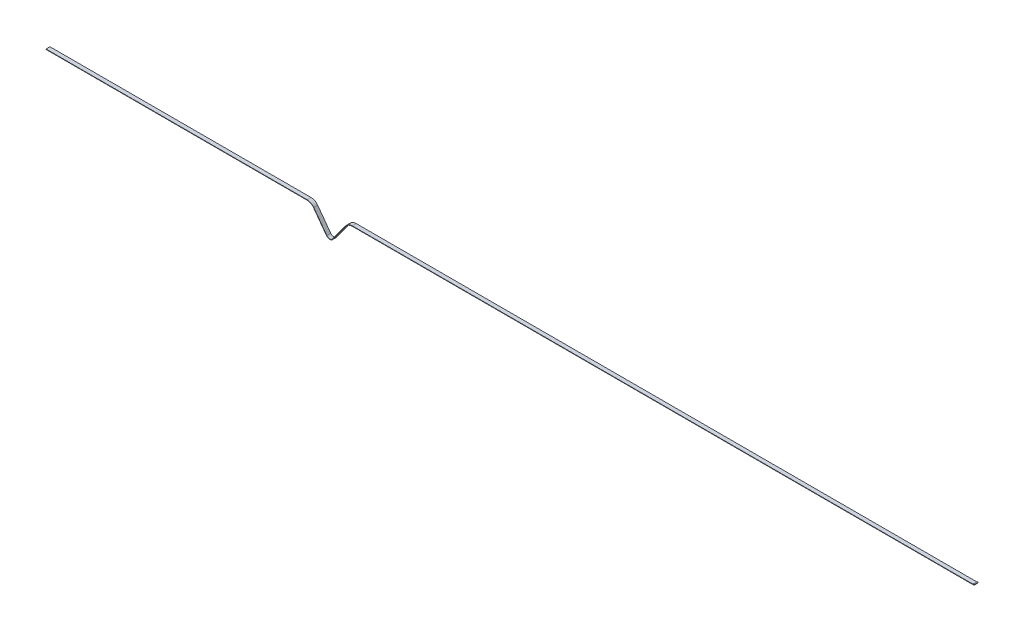
ISO-10303-21;
HEADER;
FILE_DESCRIPTION(('STEP AP214'),'2;1');
FILE_NAME('part.step','',(''),(''),'','','');
FILE_SCHEMA(('AUTOMOTIVE_DESIGN { 1 0 10303 214 1 1 1 1 }'));
ENDSEC;
DATA;
#1=APPLICATION_CONTEXT('core data for automotive mechanical design processes');
#2=APPLICATION_PROTOCOL_DEFINITION('international standard','automotive_design',2000,#1);
#3=PRODUCT_CONTEXT('',#1,'mechanical');
#4=PRODUCT('Part','Part','',(#3));
#5=PRODUCT_RELATED_PRODUCT_CATEGORY('part','',(#4));
#6=PRODUCT_DEFINITION_FORMATION('','',#4);
#7=PRODUCT_DEFINITION_CONTEXT('part definition',#1,'design');
#8=PRODUCT_DEFINITION('design','',#6,#7);
#9=PRODUCT_DEFINITION_SHAPE('','',#8);
#10=(LENGTH_UNIT() NAMED_UNIT(*) SI_UNIT(.MILLI.,.METRE.));
#11=(NAMED_UNIT(*) PLANE_ANGLE_UNIT() SI_UNIT($,.RADIAN.));
#12=(NAMED_UNIT(*) SI_UNIT($,.STERADIAN.) SOLID_ANGLE_UNIT());
#13=UNCERTAINTY_MEASURE_WITH_UNIT(LENGTH_MEASURE(1.E-05),#10,'distance_accuracy_value','');
#14=(GEOMETRIC_REPRESENTATION_CONTEXT(3) GLOBAL_UNCERTAINTY_ASSIGNED_CONTEXT((#13)) GLOBAL_UNIT_ASSIGNED_CONTEXT((#10,
#11,#12)) REPRESENTATION_CONTEXT('',''));
#15=CARTESIAN_POINT('',(0.,0.,0.));
#16=DIRECTION('',(0.,0.,1.));
#17=DIRECTION('',(1.,0.,0.));
#18=AXIS2_PLACEMENT_3D('',#15,#16,#17);
#19=CARTESIAN_POINT('',(0.,0.,0.));
#20=DIRECTION('',(-1.,0.,0.));
#21=DIRECTION('',(0.,0.,1.));
#22=AXIS2_PLACEMENT_3D('',#19,#20,#21);
#23=PLANE('',#22);
#24=DIRECTION('',(0.,-1.,0.));
#25=VECTOR('',#24,1.);
#26=CARTESIAN_POINT('',(0.,0.,0.));
#27=LINE('',#26,#25);
#28=CARTESIAN_POINT('',(0.,0.63,0.));
#29=VERTEX_POINT('',#28);
#30=CARTESIAN_POINT('',(0.,0.,0.));
#31=VERTEX_POINT('',#30);
#32=EDGE_CURVE('E247',#29,#31,#27,.T.);
#33=ORIENTED_EDGE('',*,*,#32,.T.);
#34=DIRECTION('',(0.,0.,-1.));
#35=VECTOR('',#34,1.);
#36=CARTESIAN_POINT('',(0.,0.,0.));
#37=LINE('',#36,#35);
#38=CARTESIAN_POINT('',(0.,0.,-6.));
#39=VERTEX_POINT('',#38);
#40=EDGE_CURVE('E181',#31,#39,#37,.T.);
#41=ORIENTED_EDGE('',*,*,#40,.T.);
#42=DIRECTION('',(0.,1.,0.));
#43=VECTOR('',#42,1.);
#44=CARTESIAN_POINT('',(0.,0.,-6.));
#45=LINE('',#44,#43);
#46=CARTESIAN_POINT('',(0.,0.63,-6.));
#47=VERTEX_POINT('',#46);
#48=EDGE_CURVE('E167',#39,#47,#45,.T.);
#49=ORIENTED_EDGE('',*,*,#48,.T.);
#50=DIRECTION('',(0.,0.,1.));
#51=VECTOR('',#50,1.);
#52=CARTESIAN_POINT('',(0.,0.63,0.));
#53=LINE('',#52,#51);
#54=EDGE_CURVE('E156',#47,#29,#53,.T.);
#55=ORIENTED_EDGE('',*,*,#54,.T.);
#56=EDGE_LOOP('',(#33,#41,#49,#55));
#57=FACE_BOUND('',#56,.T.);
#58=ADVANCED_FACE('F33',(#57),#23,.F.);
#59=CARTESIAN_POINT('',(-1422.4,0.,0.));
#60=DIRECTION('',(-1.,0.,0.));
#61=DIRECTION('',(0.,0.,1.));
#62=AXIS2_PLACEMENT_3D('',#59,#60,#61);
#63=PLANE('',#62);
#64=DIRECTION('',(0.,-1.,0.));
#65=VECTOR('',#64,1.);
#66=CARTESIAN_POINT('',(-1422.4,0.,0.));
#67=LINE('',#66,#65);
#68=CARTESIAN_POINT('',(-1422.4,0.629999999999918,0.));
#69=VERTEX_POINT('',#68);
#70=CARTESIAN_POINT('',(-1422.4,0.,0.));
#71=VERTEX_POINT('',#70);
#72=EDGE_CURVE('E55',#69,#71,#67,.T.);
#73=ORIENTED_EDGE('',*,*,#72,.F.);
#74=DIRECTION('',(0.,0.,1.));
#75=VECTOR('',#74,1.);
#76=CARTESIAN_POINT('',(-1422.4,0.629999999999918,0.));
#77=LINE('',#76,#75);
#78=CARTESIAN_POINT('',(-1422.4,0.629999999999918,-6.));
#79=VERTEX_POINT('',#78);
#80=EDGE_CURVE('E243',#79,#69,#77,.T.);
#81=ORIENTED_EDGE('',*,*,#80,.F.);
#82=DIRECTION('',(0.,1.,0.));
#83=VECTOR('',#82,1.);
#84=CARTESIAN_POINT('',(-1422.4,0.,-6.));
#85=LINE('',#84,#83);
#86=CARTESIAN_POINT('',(-1422.4,0.,-6.));
#87=VERTEX_POINT('',#86);
#88=EDGE_CURVE('E237',#87,#79,#85,.T.);
#89=ORIENTED_EDGE('',*,*,#88,.F.);
#90=DIRECTION('',(0.,0.,-1.));
#91=VECTOR('',#90,1.);
#92=CARTESIAN_POINT('',(-1422.4,0.,0.));
#93=LINE('',#92,#91);
#94=EDGE_CURVE('E11',#71,#87,#93,.T.);
#95=ORIENTED_EDGE('',*,*,#94,.F.);
#96=EDGE_LOOP('',(#73,#81,#89,#95));
#97=FACE_BOUND('',#96,.T.);
#98=ADVANCED_FACE('F367',(#97),#63,.T.);
#99=CARTESIAN_POINT('',(0.,0.,-6.));
#100=DIRECTION('',(0.,0.,1.));
#101=DIRECTION('',(1.,0.,0.));
#102=AXIS2_PLACEMENT_3D('',#99,#100,#101);
#103=PLANE('',#102);
#104=DIRECTION('',(-1.,0.,0.));
#105=VECTOR('',#104,1.);
#106=CARTESIAN_POINT('',(0.,0.63,-6.));
#107=LINE('',#106,#105);
#108=CARTESIAN_POINT('',(-1.5,0.63,-6.));
#109=VERTEX_POINT('',#108);
#110=CARTESIAN_POINT('',(-953.012225303262,0.629999999999884,-6.));
#111=VERTEX_POINT('',#110);
#112=EDGE_CURVE('E164',#109,#111,#107,.T.);
#113=ORIENTED_EDGE('',*,*,#112,.F.);
#114=CARTESIAN_POINT('',(-0.75,0.63,-6.));
#115=DIRECTION('',(0.,0.,1.));
#116=DIRECTION('',(1.,0.,0.));
#117=AXIS2_PLACEMENT_3D('',#114,#115,#116);
#118=CIRCLE('',#117,0.75);
#119=EDGE_CURVE('E150',#47,#109,#118,.T.);
#120=ORIENTED_EDGE('',*,*,#119,.F.);
#121=ORIENTED_EDGE('',*,*,#48,.F.);
#122=DIRECTION('',(-1.,0.,0.));
#123=VECTOR('',#122,1.);
#124=CARTESIAN_POINT('',(0.,0.,-6.));
#125=LINE('',#124,#123);
#126=CARTESIAN_POINT('',(-953.012225303262,-1.16226472890446E-13,-6.));
#127=VERTEX_POINT('',#126);
#128=EDGE_CURVE('E176',#39,#127,#125,.T.);
#129=ORIENTED_EDGE('',*,*,#128,.T.);
#130=DIRECTION('',(0.,1.,0.));
#131=VECTOR('',#130,1.);
#132=CARTESIAN_POINT('',(-953.012225303262,-1.16226472890446E-13,-6.));
#133=LINE('',#132,#131);
#134=EDGE_CURVE('E172',#127,#111,#133,.T.);
#135=ORIENTED_EDGE('',*,*,#134,.T.);
#136=EDGE_LOOP('',(#113,#120,#121,#129,#135));
#137=FACE_BOUND('',#136,.T.);
#138=ADVANCED_FACE('F170',(#137),#103,.F.);
#139=CARTESIAN_POINT('',(0.,0.63,0.));
#140=DIRECTION('',(0.,-1.,0.));
#141=DIRECTION('',(1.,0.,0.));
#142=AXIS2_PLACEMENT_3D('',#139,#140,#141);
#143=PLANE('',#142);
#144=DIRECTION('',(-1.,0.,0.));
#145=VECTOR('',#144,1.);
#146=CARTESIAN_POINT('',(0.,0.63,0.));
#147=LINE('',#146,#145);
#148=CARTESIAN_POINT('',(-1.5,0.63,0.));
#149=VERTEX_POINT('',#148);
#150=CARTESIAN_POINT('',(-953.012225303262,0.629999999999884,0.));
#151=VERTEX_POINT('',#150);
#152=EDGE_CURVE('E166',#149,#151,#147,.T.);
#153=ORIENTED_EDGE('',*,*,#152,.F.);
#154=DIRECTION('',(0.,0.,1.));
#155=VECTOR('',#154,1.);
#156=CARTESIAN_POINT('',(-1.5,0.63,-6.));
#157=LINE('',#156,#155);
#158=EDGE_CURVE('E153',#109,#149,#157,.T.);
#159=ORIENTED_EDGE('',*,*,#158,.F.);
#160=ORIENTED_EDGE('',*,*,#112,.T.);
#161=DIRECTION('',(0.,0.,1.));
#162=VECTOR('',#161,1.);
#163=CARTESIAN_POINT('',(-953.012225303262,0.629999999999884,0.));
#164=LINE('',#163,#162);
#165=EDGE_CURVE('E173',#111,#151,#164,.T.);
#166=ORIENTED_EDGE('',*,*,#165,.T.);
#167=EDGE_LOOP('',(#153,#159,#160,#166));
#168=FACE_BOUND('',#167,.T.);
#169=ADVANCED_FACE('F162',(#168),#143,.F.);
#170=CARTESIAN_POINT('',(0.,0.,0.));
#171=DIRECTION('',(0.,0.,-1.));
#172=DIRECTION('',(-1.,0.,0.));
#173=AXIS2_PLACEMENT_3D('',#170,#171,#172);
#174=PLANE('',#173);
#175=DIRECTION('',(0.,-1.,0.));
#176=VECTOR('',#175,1.);
#177=CARTESIAN_POINT('',(-953.012225303262,-1.16226472890446E-13,0.));
#178=LINE('',#177,#176);
#179=CARTESIAN_POINT('',(-953.012225303262,-1.16226472890446E-13,0.));
#180=VERTEX_POINT('',#179);
#181=EDGE_CURVE('E250',#151,#180,#178,.T.);
#182=ORIENTED_EDGE('',*,*,#181,.T.);
#183=DIRECTION('',(-1.,0.,0.));
#184=VECTOR('',#183,1.);
#185=CARTESIAN_POINT('',(0.,0.,0.));
#186=LINE('',#185,#184);
#187=EDGE_CURVE('E288',#31,#180,#186,.T.);
#188=ORIENTED_EDGE('',*,*,#187,.F.);
#189=ORIENTED_EDGE('',*,*,#32,.F.);
#190=CARTESIAN_POINT('',(-0.75,0.63,0.));
#191=DIRECTION('',(0.,0.,1.));
#192=DIRECTION('',(1.,0.,0.));
#193=AXIS2_PLACEMENT_3D('',#190,#191,#192);
#194=CIRCLE('',#193,0.75);
#195=EDGE_CURVE('E47',#29,#149,#194,.T.);
#196=ORIENTED_EDGE('',*,*,#195,.T.);
#197=ORIENTED_EDGE('',*,*,#152,.T.);
#198=EDGE_LOOP('',(#182,#188,#189,#196,#197));
#199=FACE_BOUND('',#198,.T.);
#200=ADVANCED_FACE('F415',(#199),#174,.F.);
#201=CARTESIAN_POINT('',(0.,0.,0.));
#202=DIRECTION('',(0.,1.,0.));
#203=DIRECTION('',(-1.,0.,0.));
#204=AXIS2_PLACEMENT_3D('',#201,#202,#203);
#205=PLANE('',#204);
#206=DIRECTION('',(0.,0.,-1.));
#207=VECTOR('',#206,1.);
#208=CARTESIAN_POINT('',(-953.012225303262,-1.16226472890446E-13,0.));
#209=LINE('',#208,#207);
#210=EDGE_CURVE('E192',#180,#127,#209,.T.);
#211=ORIENTED_EDGE('',*,*,#210,.T.);
#212=ORIENTED_EDGE('',*,*,#128,.F.);
#213=ORIENTED_EDGE('',*,*,#40,.F.);
#214=ORIENTED_EDGE('',*,*,#187,.T.);
#215=EDGE_LOOP('',(#211,#212,#213,#214));
#216=FACE_BOUND('',#215,.T.);
#217=ADVANCED_FACE('F408',(#216),#205,.F.);
#218=CARTESIAN_POINT('',(-953.012225303262,-1.05818132034585E-13,-6.));
#219=DIRECTION('',(0.,0.,1.));
#220=DIRECTION('',(1.,0.,0.));
#221=AXIS2_PLACEMENT_3D('',#218,#219,#220);
#222=PLANE('',#221);
#223=CARTESIAN_POINT('',(-953.012225303262,-11.949999999988,-6.));
#224=DIRECTION('',(0.,0.,1.));
#225=DIRECTION('',(0.,1.,0.));
#226=AXIS2_PLACEMENT_3D('',#223,#224,#225);
#227=CIRCLE('',#226,12.5799999999879);
#228=CARTESIAN_POINT('',(-963.152722602893,-4.50508801153134,-6.));
#229=VERTEX_POINT('',#228);
#230=EDGE_CURVE('E185',#111,#229,#227,.T.);
#231=ORIENTED_EDGE('',*,*,#230,.F.);
#232=ORIENTED_EDGE('',*,*,#134,.F.);
#233=CARTESIAN_POINT('',(-953.012225303262,-11.949999999988,-6.));
#234=DIRECTION('',(0.,0.,1.));
#235=DIRECTION('',(0.,1.,0.));
#236=AXIS2_PLACEMENT_3D('',#233,#234,#235);
#237=CIRCLE('',#236,11.9499999999879);
#238=CARTESIAN_POINT('',(-962.644891657044,-4.877925416359,-6.));
#239=VERTEX_POINT('',#238);
#240=EDGE_CURVE('E186',#127,#239,#237,.T.);
#241=ORIENTED_EDGE('',*,*,#240,.T.);
#242=DIRECTION('',(-0.806080866426157,0.591805404488381,0.));
#243=VECTOR('',#242,1.);
#244=CARTESIAN_POINT('',(-962.644891657044,-4.877925416359,-6.));
#245=LINE('',#244,#243);
#246=EDGE_CURVE('E182',#239,#229,#245,.T.);
#247=ORIENTED_EDGE('',*,*,#246,.T.);
#248=EDGE_LOOP('',(#231,#232,#241,#247));
#249=FACE_BOUND('',#248,.T.);
#250=ADVANCED_FACE('F406',(#249),#222,.F.);
#251=CARTESIAN_POINT('',(-953.012225303262,-11.949999999988,0.));
#252=DIRECTION('',(0.,0.,1.));
#253=DIRECTION('',(1.,0.,0.));
#254=AXIS2_PLACEMENT_3D('',#251,#252,#253);
#255=CYLINDRICAL_SURFACE('',#254,12.5799999999879);
#256=CARTESIAN_POINT('',(-953.012225303262,-11.949999999988,0.));
#257=DIRECTION('',(0.,0.,1.));
#258=DIRECTION('',(0.,1.,0.));
#259=AXIS2_PLACEMENT_3D('',#256,#257,#258);
#260=CIRCLE('',#259,12.5799999999879);
#261=CARTESIAN_POINT('',(-963.152722602893,-4.50508801153134,0.));
#262=VERTEX_POINT('',#261);
#263=EDGE_CURVE('E253',#151,#262,#260,.T.);
#264=ORIENTED_EDGE('',*,*,#263,.F.);
#265=ORIENTED_EDGE('',*,*,#165,.F.);
#266=ORIENTED_EDGE('',*,*,#230,.T.);
#267=DIRECTION('',(0.,0.,1.));
#268=VECTOR('',#267,1.);
#269=CARTESIAN_POINT('',(-963.152722602893,-4.50508801153132,0.));
#270=LINE('',#269,#268);
#271=EDGE_CURVE('E189',#229,#262,#270,.T.);
#272=ORIENTED_EDGE('',*,*,#271,.T.);
#273=EDGE_LOOP('',(#264,#265,#266,#272));
#274=FACE_BOUND('',#273,.T.);
#275=ADVANCED_FACE('F404',(#274),#255,.T.);
#276=CARTESIAN_POINT('',(-953.012225303262,-1.05818132034585E-13,0.));
#277=DIRECTION('',(0.,0.,-1.));
#278=DIRECTION('',(-1.,0.,0.));
#279=AXIS2_PLACEMENT_3D('',#276,#277,#278);
#280=PLANE('',#279);
#281=CARTESIAN_POINT('',(-953.012225303262,-11.949999999988,0.));
#282=DIRECTION('',(0.,0.,1.));
#283=DIRECTION('',(0.,1.,0.));
#284=AXIS2_PLACEMENT_3D('',#281,#282,#283);
#285=CIRCLE('',#284,11.9499999999879);
#286=CARTESIAN_POINT('',(-962.644891657044,-4.877925416359,0.));
#287=VERTEX_POINT('',#286);
#288=EDGE_CURVE('E292',#180,#287,#285,.T.);
#289=ORIENTED_EDGE('',*,*,#288,.F.);
#290=ORIENTED_EDGE('',*,*,#181,.F.);
#291=ORIENTED_EDGE('',*,*,#263,.T.);
#292=DIRECTION('',(0.806080866426157,-0.591805404488381,0.));
#293=VECTOR('',#292,1.);
#294=CARTESIAN_POINT('',(-962.644891657044,-4.877925416359,0.));
#295=LINE('',#294,#293);
#296=EDGE_CURVE('E256',#262,#287,#295,.T.);
#297=ORIENTED_EDGE('',*,*,#296,.T.);
#298=EDGE_LOOP('',(#289,#290,#291,#297));
#299=FACE_BOUND('',#298,.T.);
#300=ADVANCED_FACE('F395',(#299),#280,.F.);
#301=CARTESIAN_POINT('',(-953.012225303262,-11.949999999988,0.));
#302=DIRECTION('',(0.,0.,1.));
#303=DIRECTION('',(1.,0.,0.));
#304=AXIS2_PLACEMENT_3D('',#301,#302,#303);
#305=CYLINDRICAL_SURFACE('',#304,11.9499999999879);
#306=DIRECTION('',(0.,0.,-1.));
#307=VECTOR('',#306,1.);
#308=CARTESIAN_POINT('',(-962.644891657044,-4.877925416359,0.));
#309=LINE('',#308,#307);
#310=EDGE_CURVE('E203',#287,#239,#309,.T.);
#311=ORIENTED_EDGE('',*,*,#310,.T.);
#312=ORIENTED_EDGE('',*,*,#240,.F.);
#313=ORIENTED_EDGE('',*,*,#210,.F.);
#314=ORIENTED_EDGE('',*,*,#288,.T.);
#315=EDGE_LOOP('',(#311,#312,#313,#314));
#316=FACE_BOUND('',#315,.T.);
#317=ADVANCED_FACE('F389',(#316),#305,.F.);
#318=CARTESIAN_POINT('',(-962.644891657044,-4.87792541635899,-6.));
#319=DIRECTION('',(0.,0.,1.));
#320=DIRECTION('',(1.,0.,0.));
#321=AXIS2_PLACEMENT_3D('',#318,#319,#320);
#322=PLANE('',#321);
#323=DIRECTION('',(-0.591805404488379,-0.806080866426159,0.));
#324=VECTOR('',#323,1.);
#325=CARTESIAN_POINT('',(-963.152722602893,-4.50508801153131,-6.));
#326=LINE('',#325,#324);
#327=CARTESIAN_POINT('',(-983.164902155259,-31.7630936165882,-6.));
#328=VERTEX_POINT('',#327);
#329=EDGE_CURVE('E196',#229,#328,#326,.T.);
#330=ORIENTED_EDGE('',*,*,#329,.F.);
#331=ORIENTED_EDGE('',*,*,#246,.F.);
#332=DIRECTION('',(-0.591805404488379,-0.806080866426159,0.));
#333=VECTOR('',#332,1.);
#334=CARTESIAN_POINT('',(-962.644891657044,-4.87792541635899,-6.));
#335=LINE('',#334,#333);
#336=CARTESIAN_POINT('',(-982.657071209411,-32.1359310214159,-6.));
#337=VERTEX_POINT('',#336);
#338=EDGE_CURVE('E197',#239,#337,#335,.T.);
#339=ORIENTED_EDGE('',*,*,#338,.T.);
#340=DIRECTION('',(-0.806080866426158,0.591805404488379,0.));
#341=VECTOR('',#340,1.);
#342=CARTESIAN_POINT('',(-982.657071209411,-32.1359310214159,-6.));
#343=LINE('',#342,#341);
#344=EDGE_CURVE('E193',#337,#328,#343,.T.);
#345=ORIENTED_EDGE('',*,*,#344,.T.);
#346=EDGE_LOOP('',(#330,#331,#339,#345));
#347=FACE_BOUND('',#346,.T.);
#348=ADVANCED_FACE('F383',(#347),#322,.F.);
#349=CARTESIAN_POINT('',(-963.152722602893,-4.50508801153131,0.));
#350=DIRECTION('',(0.806080866426159,-0.591805404488379,0.));
#351=DIRECTION('',(0.591805404488379,0.806080866426159,0.));
#352=AXIS2_PLACEMENT_3D('',#349,#350,#351);
#353=PLANE('',#352);
#354=DIRECTION('',(-0.591805404488379,-0.806080866426159,0.));
#355=VECTOR('',#354,1.);
#356=CARTESIAN_POINT('',(-963.152722602893,-4.50508801153131,0.));
#357=LINE('',#356,#355);
#358=CARTESIAN_POINT('',(-983.164902155259,-31.7630936165882,0.));
#359=VERTEX_POINT('',#358);
#360=EDGE_CURVE('E259',#262,#359,#357,.T.);
#361=ORIENTED_EDGE('',*,*,#360,.F.);
#362=ORIENTED_EDGE('',*,*,#271,.F.);
#363=ORIENTED_EDGE('',*,*,#329,.T.);
#364=DIRECTION('',(0.,0.,1.));
#365=VECTOR('',#364,1.);
#366=CARTESIAN_POINT('',(-983.164902155259,-31.7630936165882,0.));
#367=LINE('',#366,#365);
#368=EDGE_CURVE('E200',#328,#359,#367,.T.);
#369=ORIENTED_EDGE('',*,*,#368,.T.);
#370=EDGE_LOOP('',(#361,#362,#363,#369));
#371=FACE_BOUND('',#370,.T.);
#372=ADVANCED_FACE('F401',(#371),#353,.F.);
#373=CARTESIAN_POINT('',(-962.644891657044,-4.87792541635899,0.));
#374=DIRECTION('',(0.,0.,-1.));
#375=DIRECTION('',(-1.,0.,0.));
#376=AXIS2_PLACEMENT_3D('',#373,#374,#375);
#377=PLANE('',#376);
#378=DIRECTION('',(-0.591805404488379,-0.806080866426159,0.));
#379=VECTOR('',#378,1.);
#380=CARTESIAN_POINT('',(-962.644891657044,-4.87792541635899,0.));
#381=LINE('',#380,#379);
#382=CARTESIAN_POINT('',(-982.657071209411,-32.1359310214159,0.));
#383=VERTEX_POINT('',#382);
#384=EDGE_CURVE('E297',#287,#383,#381,.T.);
#385=ORIENTED_EDGE('',*,*,#384,.F.);
#386=ORIENTED_EDGE('',*,*,#296,.F.);
#387=ORIENTED_EDGE('',*,*,#360,.T.);
#388=DIRECTION('',(0.806080866426158,-0.591805404488379,0.));
#389=VECTOR('',#388,1.);
#390=CARTESIAN_POINT('',(-982.657071209411,-32.1359310214159,0.));
#391=LINE('',#390,#389);
#392=EDGE_CURVE('E262',#359,#383,#391,.T.);
#393=ORIENTED_EDGE('',*,*,#392,.T.);
#394=EDGE_LOOP('',(#385,#386,#387,#393));
#395=FACE_BOUND('',#394,.T.);
#396=ADVANCED_FACE('F398',(#395),#377,.F.);
#397=CARTESIAN_POINT('',(-962.644891657044,-4.87792541635899,0.));
#398=DIRECTION('',(-0.806080866426159,0.591805404488379,0.));
#399=DIRECTION('',(-0.591805404488379,-0.806080866426159,0.));
#400=AXIS2_PLACEMENT_3D('',#397,#398,#399);
#401=PLANE('',#400);
#402=DIRECTION('',(0.,0.,-1.));
#403=VECTOR('',#402,1.);
#404=CARTESIAN_POINT('',(-982.657071209411,-32.1359310214159,0.));
#405=LINE('',#404,#403);
#406=EDGE_CURVE('E214',#383,#337,#405,.T.);
#407=ORIENTED_EDGE('',*,*,#406,.T.);
#408=ORIENTED_EDGE('',*,*,#338,.F.);
#409=ORIENTED_EDGE('',*,*,#310,.F.);
#410=ORIENTED_EDGE('',*,*,#384,.T.);
#411=EDGE_LOOP('',(#407,#408,#409,#410));
#412=FACE_BOUND('',#411,.T.);
#413=ADVANCED_FACE('F386',(#412),#401,.F.);
#414=CARTESIAN_POINT('',(-982.657071209411,-32.1359310214159,-6.));
#415=DIRECTION('',(0.,0.,1.));
#416=DIRECTION('',(1.,0.,0.));
#417=AXIS2_PLACEMENT_3D('',#414,#415,#416);
#418=PLANE('',#417);
#419=CARTESIAN_POINT('',(-987.582225303274,-28.5199999999919,-6.));
#420=DIRECTION('',(0.,0.,-1.));
#421=DIRECTION('',(0.806080866426158,-0.59180540448838,0.));
#422=AXIS2_PLACEMENT_3D('',#419,#420,#421);
#423=CIRCLE('',#422,5.48000000000001);
#424=CARTESIAN_POINT('',(-991.99954845129,-31.7630936165873,-6.));
#425=VERTEX_POINT('',#424);
#426=EDGE_CURVE('E207',#328,#425,#423,.T.);
#427=ORIENTED_EDGE('',*,*,#426,.F.);
#428=ORIENTED_EDGE('',*,*,#344,.F.);
#429=CARTESIAN_POINT('',(-987.582225303274,-28.5199999999919,-6.));
#430=DIRECTION('',(0.,0.,-1.));
#431=DIRECTION('',(0.806080866426159,-0.591805404488378,0.));
#432=AXIS2_PLACEMENT_3D('',#429,#430,#431);
#433=CIRCLE('',#432,6.11000000000002);
#434=CARTESIAN_POINT('',(-992.507379397139,-32.1359310214148,-6.));
#435=VERTEX_POINT('',#434);
#436=EDGE_CURVE('E208',#337,#435,#433,.T.);
#437=ORIENTED_EDGE('',*,*,#436,.T.);
#438=DIRECTION('',(0.806080866426291,0.591805404488199,0.));
#439=VECTOR('',#438,1.);
#440=CARTESIAN_POINT('',(-992.507379397139,-32.1359310214148,-6.));
#441=LINE('',#440,#439);
#442=EDGE_CURVE('E204',#435,#425,#441,.T.);
#443=ORIENTED_EDGE('',*,*,#442,.T.);
#444=EDGE_LOOP('',(#427,#428,#437,#443));
#445=FACE_BOUND('',#444,.T.);
#446=ADVANCED_FACE('F380',(#445),#418,.F.);
#447=CARTESIAN_POINT('',(-987.582225303274,-28.5199999999919,0.));
#448=DIRECTION('',(0.,0.,-1.));
#449=DIRECTION('',(-1.,0.,0.));
#450=AXIS2_PLACEMENT_3D('',#447,#448,#449);
#451=CYLINDRICAL_SURFACE('',#450,5.48000000000001);
#452=CARTESIAN_POINT('',(-987.582225303274,-28.5199999999919,0.));
#453=DIRECTION('',(0.,0.,-1.));
#454=DIRECTION('',(0.806080866426158,-0.59180540448838,0.));
#455=AXIS2_PLACEMENT_3D('',#452,#453,#454);
#456=CIRCLE('',#455,5.48000000000001);
#457=CARTESIAN_POINT('',(-991.99954845129,-31.7630936165873,0.));
#458=VERTEX_POINT('',#457);
#459=EDGE_CURVE('E265',#359,#458,#456,.T.);
#460=ORIENTED_EDGE('',*,*,#459,.F.);
#461=ORIENTED_EDGE('',*,*,#368,.F.);
#462=ORIENTED_EDGE('',*,*,#426,.T.);
#463=DIRECTION('',(0.,0.,1.));
#464=VECTOR('',#463,1.);
#465=CARTESIAN_POINT('',(-991.99954845129,-31.7630936165872,0.));
#466=LINE('',#465,#464);
#467=EDGE_CURVE('E211',#425,#458,#466,.T.);
#468=ORIENTED_EDGE('',*,*,#467,.T.);
#469=EDGE_LOOP('',(#460,#461,#462,#468));
#470=FACE_BOUND('',#469,.T.);
#471=ADVANCED_FACE('F377',(#470),#451,.F.);
#472=CARTESIAN_POINT('',(-982.657071209411,-32.1359310214159,0.));
#473=DIRECTION('',(0.,0.,-1.));
#474=DIRECTION('',(-1.,0.,0.));
#475=AXIS2_PLACEMENT_3D('',#472,#473,#474);
#476=PLANE('',#475);
#477=CARTESIAN_POINT('',(-987.582225303274,-28.5199999999919,0.));
#478=DIRECTION('',(0.,0.,-1.));
#479=DIRECTION('',(0.806080866426159,-0.591805404488378,0.));
#480=AXIS2_PLACEMENT_3D('',#477,#478,#479);
#481=CIRCLE('',#480,6.11000000000002);
#482=CARTESIAN_POINT('',(-992.507379397139,-32.1359310214148,0.));
#483=VERTEX_POINT('',#482);
#484=EDGE_CURVE('E302',#383,#483,#481,.T.);
#485=ORIENTED_EDGE('',*,*,#484,.F.);
#486=ORIENTED_EDGE('',*,*,#392,.F.);
#487=ORIENTED_EDGE('',*,*,#459,.T.);
#488=DIRECTION('',(-0.806080866426291,-0.591805404488199,0.));
#489=VECTOR('',#488,1.);
#490=CARTESIAN_POINT('',(-992.507379397139,-32.1359310214148,0.));
#491=LINE('',#490,#489);
#492=EDGE_CURVE('E268',#458,#483,#491,.T.);
#493=ORIENTED_EDGE('',*,*,#492,.T.);
#494=EDGE_LOOP('',(#485,#486,#487,#493));
#495=FACE_BOUND('',#494,.T.);
#496=ADVANCED_FACE('F355',(#495),#476,.F.);
#497=CARTESIAN_POINT('',(-987.582225303274,-28.5199999999919,0.));
#498=DIRECTION('',(0.,0.,-1.));
#499=DIRECTION('',(-1.,0.,0.));
#500=AXIS2_PLACEMENT_3D('',#497,#498,#499);
#501=CYLINDRICAL_SURFACE('',#500,6.11000000000002);
#502=DIRECTION('',(0.,0.,-1.));
#503=VECTOR('',#502,1.);
#504=CARTESIAN_POINT('',(-992.507379397139,-32.1359310214148,0.));
#505=LINE('',#504,#503);
#506=EDGE_CURVE('E225',#483,#435,#505,.T.);
#507=ORIENTED_EDGE('',*,*,#506,.T.);
#508=ORIENTED_EDGE('',*,*,#436,.F.);
#509=ORIENTED_EDGE('',*,*,#406,.F.);
#510=ORIENTED_EDGE('',*,*,#484,.T.);
#511=EDGE_LOOP('',(#507,#508,#509,#510));
#512=FACE_BOUND('',#511,.T.);
#513=ADVANCED_FACE('F350',(#512),#501,.T.);
#514=CARTESIAN_POINT('',(-992.507379397139,-32.1359310214147,-6.));
#515=DIRECTION('',(0.,0.,1.));
#516=DIRECTION('',(1.,0.,0.));
#517=AXIS2_PLACEMENT_3D('',#514,#515,#516);
#518=PLANE('',#517);
#519=DIRECTION('',(-0.591805404488197,0.806080866426292,0.));
#520=VECTOR('',#519,1.);
#521=CARTESIAN_POINT('',(-991.99954845129,-31.7630936165872,-6.));
#522=LINE('',#521,#520);
#523=CARTESIAN_POINT('',(-1012.01172800365,-4.50508801153305,-6.));
#524=VERTEX_POINT('',#523);
#525=EDGE_CURVE('E218',#425,#524,#522,.T.);
#526=ORIENTED_EDGE('',*,*,#525,.F.);
#527=ORIENTED_EDGE('',*,*,#442,.F.);
#528=DIRECTION('',(-0.591805404488197,0.806080866426292,0.));
#529=VECTOR('',#528,1.);
#530=CARTESIAN_POINT('',(-992.507379397139,-32.1359310214147,-6.));
#531=LINE('',#530,#529);
#532=CARTESIAN_POINT('',(-1012.51955894949,-4.87792541636061,-6.));
#533=VERTEX_POINT('',#532);
#534=EDGE_CURVE('E219',#435,#533,#531,.T.);
#535=ORIENTED_EDGE('',*,*,#534,.T.);
#536=DIRECTION('',(0.806080866426292,0.591805404488197,0.));
#537=VECTOR('',#536,1.);
#538=CARTESIAN_POINT('',(-1012.51955894949,-4.87792541636061,-6.));
#539=LINE('',#538,#537);
#540=EDGE_CURVE('E215',#533,#524,#539,.T.);
#541=ORIENTED_EDGE('',*,*,#540,.T.);
#542=EDGE_LOOP('',(#526,#527,#535,#541));
#543=FACE_BOUND('',#542,.T.);
#544=ADVANCED_FACE('F345',(#543),#518,.F.);
#545=CARTESIAN_POINT('',(-991.99954845129,-31.7630936165872,0.));
#546=DIRECTION('',(-0.806080866426292,-0.591805404488197,0.));
#547=DIRECTION('',(0.591805404488197,-0.806080866426292,0.));
#548=AXIS2_PLACEMENT_3D('',#545,#546,#547);
#549=PLANE('',#548);
#550=DIRECTION('',(-0.591805404488197,0.806080866426292,0.));
#551=VECTOR('',#550,1.);
#552=CARTESIAN_POINT('',(-991.99954845129,-31.7630936165872,0.));
#553=LINE('',#552,#551);
#554=CARTESIAN_POINT('',(-1012.01172800365,-4.50508801153305,0.));
#555=VERTEX_POINT('',#554);
#556=EDGE_CURVE('E271',#458,#555,#553,.T.);
#557=ORIENTED_EDGE('',*,*,#556,.F.);
#558=ORIENTED_EDGE('',*,*,#467,.F.);
#559=ORIENTED_EDGE('',*,*,#525,.T.);
#560=DIRECTION('',(0.,0.,1.));
#561=VECTOR('',#560,1.);
#562=CARTESIAN_POINT('',(-1012.01172800365,-4.50508801153305,0.));
#563=LINE('',#562,#561);
#564=EDGE_CURVE('E222',#524,#555,#563,.T.);
#565=ORIENTED_EDGE('',*,*,#564,.T.);
#566=EDGE_LOOP('',(#557,#558,#559,#565));
#567=FACE_BOUND('',#566,.T.);
#568=ADVANCED_FACE('F374',(#567),#549,.F.);
#569=CARTESIAN_POINT('',(-992.507379397139,-32.1359310214147,0.));
#570=DIRECTION('',(0.,0.,-1.));
#571=DIRECTION('',(-1.,0.,0.));
#572=AXIS2_PLACEMENT_3D('',#569,#570,#571);
#573=PLANE('',#572);
#574=DIRECTION('',(-0.591805404488197,0.806080866426292,0.));
#575=VECTOR('',#574,1.);
#576=CARTESIAN_POINT('',(-992.507379397139,-32.1359310214147,0.));
#577=LINE('',#576,#575);
#578=CARTESIAN_POINT('',(-1012.51955894949,-4.87792541636061,0.));
#579=VERTEX_POINT('',#578);
#580=EDGE_CURVE('E307',#483,#579,#577,.T.);
#581=ORIENTED_EDGE('',*,*,#580,.F.);
#582=ORIENTED_EDGE('',*,*,#492,.F.);
#583=ORIENTED_EDGE('',*,*,#556,.T.);
#584=DIRECTION('',(-0.806080866426292,-0.591805404488197,0.));
#585=VECTOR('',#584,1.);
#586=CARTESIAN_POINT('',(-1012.51955894949,-4.87792541636061,0.));
#587=LINE('',#586,#585);
#588=EDGE_CURVE('E274',#555,#579,#587,.T.);
#589=ORIENTED_EDGE('',*,*,#588,.T.);
#590=EDGE_LOOP('',(#581,#582,#583,#589));
#591=FACE_BOUND('',#590,.T.);
#592=ADVANCED_FACE('F357',(#591),#573,.F.);
#593=CARTESIAN_POINT('',(-992.507379397139,-32.1359310214147,0.));
#594=DIRECTION('',(0.806080866426292,0.591805404488197,0.));
#595=DIRECTION('',(-0.591805404488197,0.806080866426292,0.));
#596=AXIS2_PLACEMENT_3D('',#593,#594,#595);
#597=PLANE('',#596);
#598=DIRECTION('',(0.,0.,-1.));
#599=VECTOR('',#598,1.);
#600=CARTESIAN_POINT('',(-1012.51955894949,-4.87792541636061,0.));
#601=LINE('',#600,#599);
#602=EDGE_CURVE('E236',#579,#533,#601,.T.);
#603=ORIENTED_EDGE('',*,*,#602,.T.);
#604=ORIENTED_EDGE('',*,*,#534,.F.);
#605=ORIENTED_EDGE('',*,*,#506,.F.);
#606=ORIENTED_EDGE('',*,*,#580,.T.);
#607=EDGE_LOOP('',(#603,#604,#605,#606));
#608=FACE_BOUND('',#607,.T.);
#609=ADVANCED_FACE('F348',(#608),#597,.F.);
#610=CARTESIAN_POINT('',(-1012.51955894949,-4.87792541636058,-6.));
#611=DIRECTION('',(0.,0.,1.));
#612=DIRECTION('',(1.,0.,0.));
#613=AXIS2_PLACEMENT_3D('',#610,#611,#612);
#614=PLANE('',#613);
#615=CARTESIAN_POINT('',(-1022.15222530328,-11.9499999999862,-6.));
#616=DIRECTION('',(0.,0.,1.));
#617=DIRECTION('',(0.806080866426295,0.591805404488193,0.));
#618=AXIS2_PLACEMENT_3D('',#615,#616,#617);
#619=CIRCLE('',#618,12.579999999986);
#620=CARTESIAN_POINT('',(-1022.15222530328,0.629999999999811,-6.));
#621=VERTEX_POINT('',#620);
#622=EDGE_CURVE('E229',#524,#621,#619,.T.);
#623=ORIENTED_EDGE('',*,*,#622,.F.);
#624=ORIENTED_EDGE('',*,*,#540,.F.);
#625=CARTESIAN_POINT('',(-1022.15222530328,-11.9499999999862,-6.));
#626=DIRECTION('',(0.,0.,1.));
#627=DIRECTION('',(0.806080866426294,0.591805404488194,0.));
#628=AXIS2_PLACEMENT_3D('',#625,#626,#627);
#629=CIRCLE('',#628,11.949999999986);
#630=CARTESIAN_POINT('',(-1022.15222530328,-2.25514051876985E-13,-6.));
#631=VERTEX_POINT('',#630);
#632=EDGE_CURVE('E230',#533,#631,#629,.T.);
#633=ORIENTED_EDGE('',*,*,#632,.T.);
#634=DIRECTION('',(0.,1.,0.));
#635=VECTOR('',#634,1.);
#636=CARTESIAN_POINT('',(-1022.15222530328,-1.85615411929518E-13,-6.));
#637=LINE('',#636,#635);
#638=EDGE_CURVE('E226',#631,#621,#637,.T.);
#639=ORIENTED_EDGE('',*,*,#638,.T.);
#640=EDGE_LOOP('',(#623,#624,#633,#639));
#641=FACE_BOUND('',#640,.T.);
#642=ADVANCED_FACE('F341',(#641),#614,.F.);
#643=CARTESIAN_POINT('',(-1022.15222530328,-11.9499999999862,0.));
#644=DIRECTION('',(0.,0.,1.));
#645=DIRECTION('',(1.,0.,0.));
#646=AXIS2_PLACEMENT_3D('',#643,#644,#645);
#647=CYLINDRICAL_SURFACE('',#646,12.579999999986);
#648=CARTESIAN_POINT('',(-1022.15222530328,-11.9499999999862,0.));
#649=DIRECTION('',(0.,0.,1.));
#650=DIRECTION('',(0.806080866426295,0.591805404488193,0.));
#651=AXIS2_PLACEMENT_3D('',#648,#649,#650);
#652=CIRCLE('',#651,12.579999999986);
#653=CARTESIAN_POINT('',(-1022.15222530328,0.629999999999811,0.));
#654=VERTEX_POINT('',#653);
#655=EDGE_CURVE('E277',#555,#654,#652,.T.);
#656=ORIENTED_EDGE('',*,*,#655,.F.);
#657=ORIENTED_EDGE('',*,*,#564,.F.);
#658=ORIENTED_EDGE('',*,*,#622,.T.);
#659=DIRECTION('',(0.,0.,1.));
#660=VECTOR('',#659,1.);
#661=CARTESIAN_POINT('',(-1022.15222530328,0.629999999999814,0.));
#662=LINE('',#661,#660);
#663=EDGE_CURVE('E233',#621,#654,#662,.T.);
#664=ORIENTED_EDGE('',*,*,#663,.T.);
#665=EDGE_LOOP('',(#656,#657,#658,#664));
#666=FACE_BOUND('',#665,.T.);
#667=ADVANCED_FACE('F371',(#666),#647,.T.);
#668=CARTESIAN_POINT('',(-1012.51955894949,-4.87792541636058,0.));
#669=DIRECTION('',(0.,0.,-1.));
#670=DIRECTION('',(-1.,0.,0.));
#671=AXIS2_PLACEMENT_3D('',#668,#669,#670);
#672=PLANE('',#671);
#673=CARTESIAN_POINT('',(-1022.15222530328,-11.9499999999862,0.));
#674=DIRECTION('',(0.,0.,1.));
#675=DIRECTION('',(0.806080866426294,0.591805404488194,0.));
#676=AXIS2_PLACEMENT_3D('',#673,#674,#675);
#677=CIRCLE('',#676,11.949999999986);
#678=CARTESIAN_POINT('',(-1022.15222530328,-2.25514051876985E-13,0.));
#679=VERTEX_POINT('',#678);
#680=EDGE_CURVE('E312',#579,#679,#677,.T.);
#681=ORIENTED_EDGE('',*,*,#680,.F.);
#682=ORIENTED_EDGE('',*,*,#588,.F.);
#683=ORIENTED_EDGE('',*,*,#655,.T.);
#684=DIRECTION('',(0.,-1.,0.));
#685=VECTOR('',#684,1.);
#686=CARTESIAN_POINT('',(-1022.15222530328,-1.85615411929518E-13,0.));
#687=LINE('',#686,#685);
#688=EDGE_CURVE('E280',#654,#679,#687,.T.);
#689=ORIENTED_EDGE('',*,*,#688,.T.);
#690=EDGE_LOOP('',(#681,#682,#683,#689));
#691=FACE_BOUND('',#690,.T.);
#692=ADVANCED_FACE('F360',(#691),#672,.F.);
#693=CARTESIAN_POINT('',(-1022.15222530328,-11.9499999999862,0.));
#694=DIRECTION('',(0.,0.,1.));
#695=DIRECTION('',(1.,0.,0.));
#696=AXIS2_PLACEMENT_3D('',#693,#694,#695);
#697=CYLINDRICAL_SURFACE('',#696,11.949999999986);
#698=DIRECTION('',(0.,0.,-1.));
#699=VECTOR('',#698,1.);
#700=CARTESIAN_POINT('',(-1022.15222530328,-1.85615411929518E-13,0.));
#701=LINE('',#700,#699);
#702=EDGE_CURVE('E246',#679,#631,#701,.T.);
#703=ORIENTED_EDGE('',*,*,#702,.T.);
#704=ORIENTED_EDGE('',*,*,#632,.F.);
#705=ORIENTED_EDGE('',*,*,#602,.F.);
#706=ORIENTED_EDGE('',*,*,#680,.T.);
#707=EDGE_LOOP('',(#703,#704,#705,#706));
#708=FACE_BOUND('',#707,.T.);
#709=ADVANCED_FACE('F333',(#708),#697,.F.);
#710=CARTESIAN_POINT('',(-1022.15222530328,-1.2490009027033E-13,-6.));
#711=DIRECTION('',(0.,0.,1.));
#712=DIRECTION('',(1.,0.,0.));
#713=AXIS2_PLACEMENT_3D('',#710,#711,#712);
#714=PLANE('',#713);
#715=DIRECTION('',(-1.,0.,0.));
#716=VECTOR('',#715,1.);
#717=CARTESIAN_POINT('',(-1022.15222530328,0.629999999999875,-6.));
#718=LINE('',#717,#716);
#719=EDGE_CURVE('E239',#621,#79,#718,.T.);
#720=ORIENTED_EDGE('',*,*,#719,.F.);
#721=ORIENTED_EDGE('',*,*,#638,.F.);
#722=DIRECTION('',(-1.,0.,0.));
#723=VECTOR('',#722,1.);
#724=CARTESIAN_POINT('',(-1022.15222530328,-1.2490009027033E-13,-6.));
#725=LINE('',#724,#723);
#726=EDGE_CURVE('E240',#631,#87,#725,.T.);
#727=ORIENTED_EDGE('',*,*,#726,.T.);
#728=ORIENTED_EDGE('',*,*,#88,.T.);
#729=EDGE_LOOP('',(#720,#721,#727,#728));
#730=FACE_BOUND('',#729,.T.);
#731=ADVANCED_FACE('F337',(#730),#714,.F.);
#732=CARTESIAN_POINT('',(-1022.15222530328,0.629999999999875,0.));
#733=DIRECTION('',(0.,-1.,0.));
#734=DIRECTION('',(1.,0.,0.));
#735=AXIS2_PLACEMENT_3D('',#732,#733,#734);
#736=PLANE('',#735);
#737=DIRECTION('',(-1.,0.,0.));
#738=VECTOR('',#737,1.);
#739=CARTESIAN_POINT('',(-1022.15222530328,0.629999999999875,0.));
#740=LINE('',#739,#738);
#741=EDGE_CURVE('E282',#654,#69,#740,.T.);
#742=ORIENTED_EDGE('',*,*,#741,.F.);
#743=ORIENTED_EDGE('',*,*,#663,.F.);
#744=ORIENTED_EDGE('',*,*,#719,.T.);
#745=ORIENTED_EDGE('',*,*,#80,.T.);
#746=EDGE_LOOP('',(#742,#743,#744,#745));
#747=FACE_BOUND('',#746,.T.);
#748=ADVANCED_FACE('F369',(#747),#736,.F.);
#749=CARTESIAN_POINT('',(-1022.15222530328,-1.2490009027033E-13,0.));
#750=DIRECTION('',(0.,0.,-1.));
#751=DIRECTION('',(-1.,0.,0.));
#752=AXIS2_PLACEMENT_3D('',#749,#750,#751);
#753=PLANE('',#752);
#754=DIRECTION('',(-1.,0.,0.));
#755=VECTOR('',#754,1.);
#756=CARTESIAN_POINT('',(-1022.15222530328,-1.2490009027033E-13,0.));
#757=LINE('',#756,#755);
#758=EDGE_CURVE('E40',#679,#71,#757,.T.);
#759=ORIENTED_EDGE('',*,*,#758,.F.);
#760=ORIENTED_EDGE('',*,*,#688,.F.);
#761=ORIENTED_EDGE('',*,*,#741,.T.);
#762=ORIENTED_EDGE('',*,*,#72,.T.);
#763=EDGE_LOOP('',(#759,#760,#761,#762));
#764=FACE_BOUND('',#763,.T.);
#765=ADVANCED_FACE('F362',(#764),#753,.F.);
#766=CARTESIAN_POINT('',(-1022.15222530328,-1.2490009027033E-13,0.));
#767=DIRECTION('',(0.,1.,0.));
#768=DIRECTION('',(-1.,0.,0.));
#769=AXIS2_PLACEMENT_3D('',#766,#767,#768);
#770=PLANE('',#769);
#771=ORIENTED_EDGE('',*,*,#94,.T.);
#772=ORIENTED_EDGE('',*,*,#726,.F.);
#773=ORIENTED_EDGE('',*,*,#702,.F.);
#774=ORIENTED_EDGE('',*,*,#758,.T.);
#775=EDGE_LOOP('',(#771,#772,#773,#774));
#776=FACE_BOUND('',#775,.T.);
#777=ADVANCED_FACE('F363',(#776),#770,.F.);
#778=CARTESIAN_POINT('',(-0.75,0.63,-6.));
#779=DIRECTION('',(0.,0.,1.));
#780=DIRECTION('',(1.,0.,0.));
#781=AXIS2_PLACEMENT_3D('',#778,#779,#780);
#782=CYLINDRICAL_SURFACE('',#781,0.75);
#783=ORIENTED_EDGE('',*,*,#195,.F.);
#784=ORIENTED_EDGE('',*,*,#54,.F.);
#785=ORIENTED_EDGE('',*,*,#119,.T.);
#786=ORIENTED_EDGE('',*,*,#158,.T.);
#787=EDGE_LOOP('',(#783,#784,#785,#786));
#788=FACE_BOUND('',#787,.T.);
#789=ADVANCED_FACE('F152',(#788),#782,.T.);
#790=CLOSED_SHELL('',(#58,#98,#138,#169,#200,#217,#250,#275,#300,#317,#348,#372,#396,#413,#446,
#471,#496,#513,#544,#568,#592,#609,#642,#667,#692,#709,#731,#748,#765,#777,#789));
#791=MANIFOLD_SOLID_BREP('B2',#790);
#792=ADVANCED_BREP_SHAPE_REPRESENTATION('',(#18,#791),#14);
#793=SHAPE_DEFINITION_REPRESENTATION(#9,#792);
ENDSEC;
END-ISO-10303-21;
